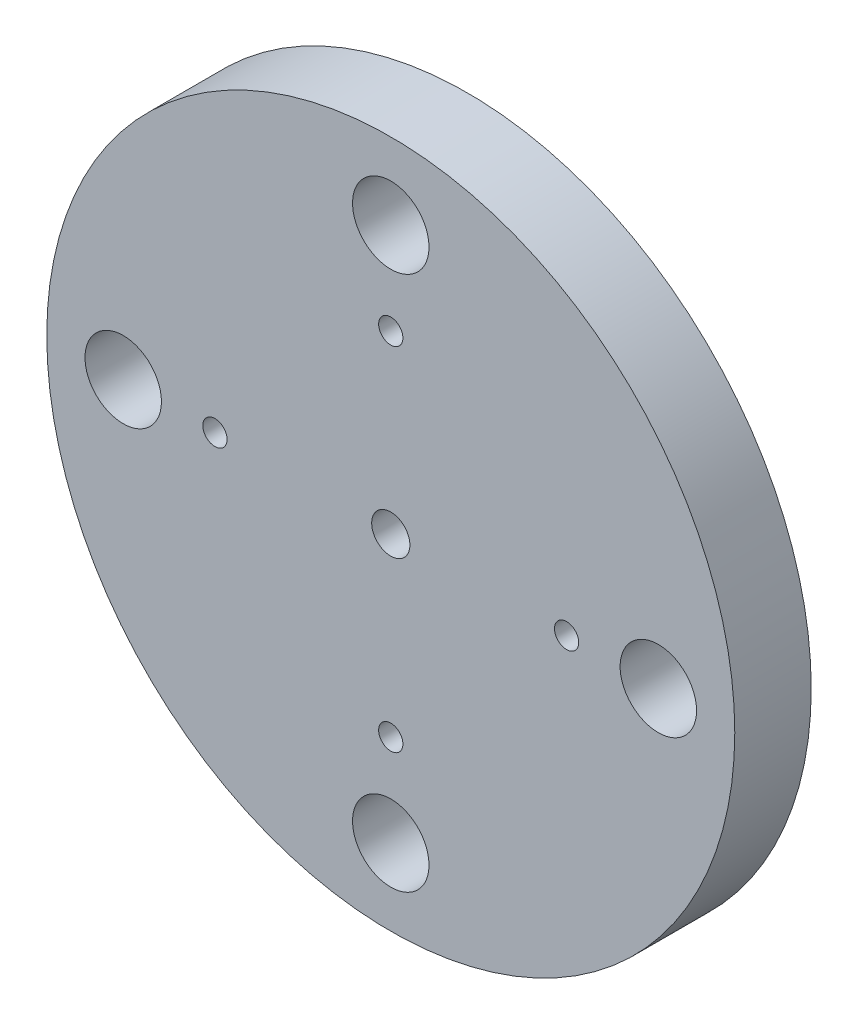
ISO-10303-21;
HEADER;
FILE_DESCRIPTION(('STEP AP214'),'2;1');
FILE_NAME('part.step','',(''),(''),'','','');
FILE_SCHEMA(('AUTOMOTIVE_DESIGN { 1 0 10303 214 1 1 1 1 }'));
ENDSEC;
DATA;
#1=APPLICATION_CONTEXT('core data for automotive mechanical design processes');
#2=APPLICATION_PROTOCOL_DEFINITION('international standard','automotive_design',2000,#1);
#3=PRODUCT_CONTEXT('',#1,'mechanical');
#4=PRODUCT('Part','Part','',(#3));
#5=PRODUCT_RELATED_PRODUCT_CATEGORY('part','',(#4));
#6=PRODUCT_DEFINITION_FORMATION('','',#4);
#7=PRODUCT_DEFINITION_CONTEXT('part definition',#1,'design');
#8=PRODUCT_DEFINITION('design','',#6,#7);
#9=PRODUCT_DEFINITION_SHAPE('','',#8);
#10=(LENGTH_UNIT() NAMED_UNIT(*) SI_UNIT(.MILLI.,.METRE.));
#11=(NAMED_UNIT(*) PLANE_ANGLE_UNIT() SI_UNIT($,.RADIAN.));
#12=(NAMED_UNIT(*) SI_UNIT($,.STERADIAN.) SOLID_ANGLE_UNIT());
#13=UNCERTAINTY_MEASURE_WITH_UNIT(LENGTH_MEASURE(1.E-05),#10,'distance_accuracy_value','');
#14=(GEOMETRIC_REPRESENTATION_CONTEXT(3) GLOBAL_UNCERTAINTY_ASSIGNED_CONTEXT((#13)) GLOBAL_UNIT_ASSIGNED_CONTEXT((#10,
#11,#12)) REPRESENTATION_CONTEXT('',''));
#15=CARTESIAN_POINT('',(0.,0.,0.));
#16=DIRECTION('',(0.,0.,1.));
#17=DIRECTION('',(1.,0.,0.));
#18=AXIS2_PLACEMENT_3D('',#15,#16,#17);
#19=CARTESIAN_POINT('',(0.,0.,10.));
#20=DIRECTION('',(0.,0.,-1.));
#21=DIRECTION('',(-1.,0.,0.));
#22=AXIS2_PLACEMENT_3D('',#19,#20,#21);
#23=CYLINDRICAL_SURFACE('',#22,45.);
#24=CARTESIAN_POINT('',(0.,0.,10.));
#25=DIRECTION('',(0.,0.,1.));
#26=DIRECTION('',(1.,0.,0.));
#27=AXIS2_PLACEMENT_3D('',#24,#25,#26);
#28=CIRCLE('',#27,45.);
#29=CARTESIAN_POINT('',(45.,0.,10.));
#30=VERTEX_POINT('',#29);
#31=EDGE_CURVE('E10',#30,#30,#28,.T.);
#32=ORIENTED_EDGE('',*,*,#31,.F.);
#33=EDGE_LOOP('',(#32));
#34=FACE_BOUND('',#33,.T.);
#35=CARTESIAN_POINT('',(0.,0.,0.));
#36=DIRECTION('',(0.,0.,1.));
#37=DIRECTION('',(1.,0.,0.));
#38=AXIS2_PLACEMENT_3D('',#35,#36,#37);
#39=CIRCLE('',#38,45.);
#40=CARTESIAN_POINT('',(45.,0.,0.));
#41=VERTEX_POINT('',#40);
#42=EDGE_CURVE('E33',#41,#41,#39,.T.);
#43=ORIENTED_EDGE('',*,*,#42,.T.);
#44=EDGE_LOOP('',(#43));
#45=FACE_BOUND('',#44,.T.);
#46=ADVANCED_FACE('F30',(#34,#45),#23,.T.);
#47=CARTESIAN_POINT('',(0.,0.,10.));
#48=DIRECTION('',(0.,0.,1.));
#49=DIRECTION('',(1.,0.,0.));
#50=AXIS2_PLACEMENT_3D('',#47,#48,#49);
#51=PLANE('',#50);
#52=CARTESIAN_POINT('',(0.,23.,10.));
#53=DIRECTION('',(0.,0.,1.));
#54=DIRECTION('',(1.,0.,0.));
#55=AXIS2_PLACEMENT_3D('',#52,#53,#54);
#56=CIRCLE('',#55,1.58749999999999);
#57=CARTESIAN_POINT('',(1.58749999999999,23.,10.));
#58=VERTEX_POINT('',#57);
#59=EDGE_CURVE('E92',#58,#58,#56,.T.);
#60=ORIENTED_EDGE('',*,*,#59,.F.);
#61=EDGE_LOOP('',(#60));
#62=FACE_BOUND('',#61,.T.);
#63=CARTESIAN_POINT('',(23.0000000000007,6.50882629261253E-13,10.));
#64=DIRECTION('',(0.,0.,1.));
#65=DIRECTION('',(1.,0.,0.));
#66=AXIS2_PLACEMENT_3D('',#63,#64,#65);
#67=CIRCLE('',#66,1.58749999999999);
#68=CARTESIAN_POINT('',(24.5875000000006,6.50882629261253E-13,10.));
#69=VERTEX_POINT('',#68);
#70=EDGE_CURVE('E86',#69,#69,#67,.T.);
#71=ORIENTED_EDGE('',*,*,#70,.F.);
#72=EDGE_LOOP('',(#71));
#73=FACE_BOUND('',#72,.T.);
#74=CARTESIAN_POINT('',(1.30176525852251E-12,-23.,10.));
#75=DIRECTION('',(0.,0.,1.));
#76=DIRECTION('',(1.,0.,0.));
#77=AXIS2_PLACEMENT_3D('',#74,#75,#76);
#78=CIRCLE('',#77,1.58749999999999);
#79=CARTESIAN_POINT('',(1.58750000000129,-23.,10.));
#80=VERTEX_POINT('',#79);
#81=EDGE_CURVE('E80',#80,#80,#78,.T.);
#82=ORIENTED_EDGE('',*,*,#81,.F.);
#83=EDGE_LOOP('',(#82));
#84=FACE_BOUND('',#83,.T.);
#85=CARTESIAN_POINT('',(-22.9999999999993,-6.48065941623215E-13,10.));
#86=DIRECTION('',(0.,0.,1.));
#87=DIRECTION('',(1.,0.,0.));
#88=AXIS2_PLACEMENT_3D('',#85,#86,#87);
#89=CIRCLE('',#88,1.58749999999999);
#90=CARTESIAN_POINT('',(-21.4124999999994,-6.48065941623215E-13,10.));
#91=VERTEX_POINT('',#90);
#92=EDGE_CURVE('E74',#91,#91,#89,.T.);
#93=ORIENTED_EDGE('',*,*,#92,.F.);
#94=EDGE_LOOP('',(#93));
#95=FACE_BOUND('',#94,.T.);
#96=CARTESIAN_POINT('',(0.,35.,10.));
#97=DIRECTION('',(0.,0.,1.));
#98=DIRECTION('',(1.,0.,0.));
#99=AXIS2_PLACEMENT_3D('',#96,#97,#98);
#100=CIRCLE('',#99,5.);
#101=CARTESIAN_POINT('',(5.,35.,10.));
#102=VERTEX_POINT('',#101);
#103=EDGE_CURVE('E67',#102,#102,#100,.T.);
#104=ORIENTED_EDGE('',*,*,#103,.F.);
#105=EDGE_LOOP('',(#104));
#106=FACE_BOUND('',#105,.T.);
#107=CARTESIAN_POINT('',(35.000000000001,9.90473566267125E-13,10.));
#108=DIRECTION('',(0.,0.,1.));
#109=DIRECTION('',(1.,0.,0.));
#110=AXIS2_PLACEMENT_3D('',#107,#108,#109);
#111=CIRCLE('',#110,5.00000000000077);
#112=CARTESIAN_POINT('',(40.0000000000018,9.90473566267125E-13,10.));
#113=VERTEX_POINT('',#112);
#114=EDGE_CURVE('E61',#113,#113,#111,.T.);
#115=ORIENTED_EDGE('',*,*,#114,.F.);
#116=EDGE_LOOP('',(#115));
#117=FACE_BOUND('',#116,.T.);
#118=CARTESIAN_POINT('',(1.98094713253425E-12,-35.,10.));
#119=DIRECTION('',(0.,0.,1.));
#120=DIRECTION('',(1.,0.,0.));
#121=AXIS2_PLACEMENT_3D('',#118,#119,#120);
#122=CIRCLE('',#121,5.00000000000213);
#123=CARTESIAN_POINT('',(5.00000000000411,-35.,10.));
#124=VERTEX_POINT('',#123);
#125=EDGE_CURVE('E55',#124,#124,#122,.T.);
#126=ORIENTED_EDGE('',*,*,#125,.F.);
#127=EDGE_LOOP('',(#126));
#128=FACE_BOUND('',#127,.T.);
#129=CARTESIAN_POINT('',(-34.999999999999,-9.9475983006414E-13,10.));
#130=DIRECTION('',(0.,0.,1.));
#131=DIRECTION('',(1.,0.,0.));
#132=AXIS2_PLACEMENT_3D('',#129,#130,#131);
#133=CIRCLE('',#132,5.00000000000159);
#134=CARTESIAN_POINT('',(-29.9999999999974,-9.9475983006414E-13,10.));
#135=VERTEX_POINT('',#134);
#136=EDGE_CURVE('E48',#135,#135,#133,.T.);
#137=ORIENTED_EDGE('',*,*,#136,.F.);
#138=EDGE_LOOP('',(#137));
#139=FACE_BOUND('',#138,.T.);
#140=CARTESIAN_POINT('',(0.,0.,10.));
#141=DIRECTION('',(0.,0.,-1.));
#142=DIRECTION('',(-1.,0.,0.));
#143=AXIS2_PLACEMENT_3D('',#140,#141,#142);
#144=CIRCLE('',#143,2.5);
#145=CARTESIAN_POINT('',(-2.5,0.,10.));
#146=VERTEX_POINT('',#145);
#147=EDGE_CURVE('E40',#146,#146,#144,.T.);
#148=ORIENTED_EDGE('',*,*,#147,.T.);
#149=EDGE_LOOP('',(#148));
#150=FACE_BOUND('',#149,.T.);
#151=ORIENTED_EDGE('',*,*,#31,.T.);
#152=EDGE_LOOP('',(#151));
#153=FACE_BOUND('',#152,.T.);
#154=ADVANCED_FACE('F98',(#62,#73,#84,#95,#106,#117,#128,#139,#150,#153),#51,.T.);
#155=CARTESIAN_POINT('',(0.,0.,0.));
#156=DIRECTION('',(0.,0.,1.));
#157=DIRECTION('',(1.,0.,0.));
#158=AXIS2_PLACEMENT_3D('',#155,#156,#157);
#159=PLANE('',#158);
#160=CARTESIAN_POINT('',(0.,23.,0.));
#161=DIRECTION('',(0.,0.,1.));
#162=DIRECTION('',(1.,0.,0.));
#163=AXIS2_PLACEMENT_3D('',#160,#161,#162);
#164=CIRCLE('',#163,1.5875);
#165=CARTESIAN_POINT('',(1.5875,23.,0.));
#166=VERTEX_POINT('',#165);
#167=EDGE_CURVE('E89',#166,#166,#164,.T.);
#168=ORIENTED_EDGE('',*,*,#167,.T.);
#169=EDGE_LOOP('',(#168));
#170=FACE_BOUND('',#169,.T.);
#171=CARTESIAN_POINT('',(23.0000000000007,6.50882629261253E-13,0.));
#172=DIRECTION('',(0.,0.,1.));
#173=DIRECTION('',(1.,0.,0.));
#174=AXIS2_PLACEMENT_3D('',#171,#172,#173);
#175=CIRCLE('',#174,1.5875);
#176=CARTESIAN_POINT('',(24.5875000000006,6.50882629261253E-13,0.));
#177=VERTEX_POINT('',#176);
#178=EDGE_CURVE('E83',#177,#177,#175,.T.);
#179=ORIENTED_EDGE('',*,*,#178,.T.);
#180=EDGE_LOOP('',(#179));
#181=FACE_BOUND('',#180,.T.);
#182=CARTESIAN_POINT('',(1.30176525852251E-12,-23.,0.));
#183=DIRECTION('',(0.,0.,1.));
#184=DIRECTION('',(1.,0.,0.));
#185=AXIS2_PLACEMENT_3D('',#182,#183,#184);
#186=CIRCLE('',#185,1.5875);
#187=CARTESIAN_POINT('',(1.5875000000013,-23.,0.));
#188=VERTEX_POINT('',#187);
#189=EDGE_CURVE('E77',#188,#188,#186,.T.);
#190=ORIENTED_EDGE('',*,*,#189,.T.);
#191=EDGE_LOOP('',(#190));
#192=FACE_BOUND('',#191,.T.);
#193=CARTESIAN_POINT('',(-22.9999999999993,-6.48065941623215E-13,0.));
#194=DIRECTION('',(0.,0.,1.));
#195=DIRECTION('',(1.,0.,0.));
#196=AXIS2_PLACEMENT_3D('',#193,#194,#195);
#197=CIRCLE('',#196,1.5875);
#198=CARTESIAN_POINT('',(-21.4124999999994,-6.48065941623215E-13,0.));
#199=VERTEX_POINT('',#198);
#200=EDGE_CURVE('E52',#199,#199,#197,.T.);
#201=ORIENTED_EDGE('',*,*,#200,.T.);
#202=EDGE_LOOP('',(#201));
#203=FACE_BOUND('',#202,.T.);
#204=CARTESIAN_POINT('',(0.,35.,0.));
#205=DIRECTION('',(0.,0.,1.));
#206=DIRECTION('',(1.,0.,0.));
#207=AXIS2_PLACEMENT_3D('',#204,#205,#206);
#208=CIRCLE('',#207,5.);
#209=CARTESIAN_POINT('',(5.,35.,0.));
#210=VERTEX_POINT('',#209);
#211=EDGE_CURVE('E45',#210,#210,#208,.T.);
#212=ORIENTED_EDGE('',*,*,#211,.T.);
#213=EDGE_LOOP('',(#212));
#214=FACE_BOUND('',#213,.T.);
#215=CARTESIAN_POINT('',(35.000000000001,9.90473566267125E-13,0.));
#216=DIRECTION('',(0.,0.,1.));
#217=DIRECTION('',(1.,0.,0.));
#218=AXIS2_PLACEMENT_3D('',#215,#216,#217);
#219=CIRCLE('',#218,5.00000000000077);
#220=CARTESIAN_POINT('',(40.0000000000018,9.90473566267125E-13,0.));
#221=VERTEX_POINT('',#220);
#222=EDGE_CURVE('E64',#221,#221,#219,.T.);
#223=ORIENTED_EDGE('',*,*,#222,.T.);
#224=EDGE_LOOP('',(#223));
#225=FACE_BOUND('',#224,.T.);
#226=CARTESIAN_POINT('',(1.98094713253425E-12,-35.,0.));
#227=DIRECTION('',(0.,0.,1.));
#228=DIRECTION('',(1.,0.,0.));
#229=AXIS2_PLACEMENT_3D('',#226,#227,#228);
#230=CIRCLE('',#229,5.00000000000213);
#231=CARTESIAN_POINT('',(5.00000000000411,-35.,0.));
#232=VERTEX_POINT('',#231);
#233=EDGE_CURVE('E58',#232,#232,#230,.T.);
#234=ORIENTED_EDGE('',*,*,#233,.T.);
#235=EDGE_LOOP('',(#234));
#236=FACE_BOUND('',#235,.T.);
#237=CARTESIAN_POINT('',(-34.999999999999,-9.9475983006414E-13,0.));
#238=DIRECTION('',(0.,0.,1.));
#239=DIRECTION('',(1.,0.,0.));
#240=AXIS2_PLACEMENT_3D('',#237,#238,#239);
#241=CIRCLE('',#240,5.00000000000159);
#242=CARTESIAN_POINT('',(-29.9999999999974,-9.9475983006414E-13,0.));
#243=VERTEX_POINT('',#242);
#244=EDGE_CURVE('E51',#243,#243,#241,.T.);
#245=ORIENTED_EDGE('',*,*,#244,.T.);
#246=EDGE_LOOP('',(#245));
#247=FACE_BOUND('',#246,.T.);
#248=CARTESIAN_POINT('',(0.,0.,0.));
#249=DIRECTION('',(0.,0.,-1.));
#250=DIRECTION('',(-1.,0.,0.));
#251=AXIS2_PLACEMENT_3D('',#248,#249,#250);
#252=CIRCLE('',#251,2.5);
#253=CARTESIAN_POINT('',(-2.5,0.,0.));
#254=VERTEX_POINT('',#253);
#255=EDGE_CURVE('E42',#254,#254,#252,.T.);
#256=ORIENTED_EDGE('',*,*,#255,.F.);
#257=EDGE_LOOP('',(#256));
#258=FACE_BOUND('',#257,.T.);
#259=ORIENTED_EDGE('',*,*,#42,.F.);
#260=EDGE_LOOP('',(#259));
#261=FACE_BOUND('',#260,.T.);
#262=ADVANCED_FACE('F101',(#170,#181,#192,#203,#214,#225,#236,#247,#258,#261),#159,.F.);
#263=CARTESIAN_POINT('',(0.,0.,10.));
#264=DIRECTION('',(0.,0.,-1.));
#265=DIRECTION('',(-1.,0.,0.));
#266=AXIS2_PLACEMENT_3D('',#263,#264,#265);
#267=CYLINDRICAL_SURFACE('',#266,2.5);
#268=ORIENTED_EDGE('',*,*,#147,.F.);
#269=EDGE_LOOP('',(#268));
#270=FACE_BOUND('',#269,.T.);
#271=ORIENTED_EDGE('',*,*,#255,.T.);
#272=EDGE_LOOP('',(#271));
#273=FACE_BOUND('',#272,.T.);
#274=ADVANCED_FACE('F119',(#270,#273),#267,.F.);
#275=CARTESIAN_POINT('',(-34.999999999999,-9.9475983006414E-13,0.));
#276=DIRECTION('',(0.,0.,1.));
#277=DIRECTION('',(1.,0.,0.));
#278=AXIS2_PLACEMENT_3D('',#275,#276,#277);
#279=CYLINDRICAL_SURFACE('',#278,5.00000000000159);
#280=ORIENTED_EDGE('',*,*,#244,.F.);
#281=EDGE_LOOP('',(#280));
#282=FACE_BOUND('',#281,.T.);
#283=ORIENTED_EDGE('',*,*,#136,.T.);
#284=EDGE_LOOP('',(#283));
#285=FACE_BOUND('',#284,.T.);
#286=ADVANCED_FACE('F122',(#282,#285),#279,.F.);
#287=CARTESIAN_POINT('',(1.98094713253425E-12,-35.,0.));
#288=DIRECTION('',(0.,0.,1.));
#289=DIRECTION('',(1.,0.,0.));
#290=AXIS2_PLACEMENT_3D('',#287,#288,#289);
#291=CYLINDRICAL_SURFACE('',#290,5.00000000000213);
#292=ORIENTED_EDGE('',*,*,#233,.F.);
#293=EDGE_LOOP('',(#292));
#294=FACE_BOUND('',#293,.T.);
#295=ORIENTED_EDGE('',*,*,#125,.T.);
#296=EDGE_LOOP('',(#295));
#297=FACE_BOUND('',#296,.T.);
#298=ADVANCED_FACE('F155',(#294,#297),#291,.F.);
#299=CARTESIAN_POINT('',(35.000000000001,9.90473566267125E-13,0.));
#300=DIRECTION('',(0.,0.,1.));
#301=DIRECTION('',(1.,0.,0.));
#302=AXIS2_PLACEMENT_3D('',#299,#300,#301);
#303=CYLINDRICAL_SURFACE('',#302,5.00000000000077);
#304=ORIENTED_EDGE('',*,*,#222,.F.);
#305=EDGE_LOOP('',(#304));
#306=FACE_BOUND('',#305,.T.);
#307=ORIENTED_EDGE('',*,*,#114,.T.);
#308=EDGE_LOOP('',(#307));
#309=FACE_BOUND('',#308,.T.);
#310=ADVANCED_FACE('F163',(#306,#309),#303,.F.);
#311=CARTESIAN_POINT('',(0.,35.,0.));
#312=DIRECTION('',(0.,0.,1.));
#313=DIRECTION('',(1.,0.,0.));
#314=AXIS2_PLACEMENT_3D('',#311,#312,#313);
#315=CYLINDRICAL_SURFACE('',#314,5.);
#316=ORIENTED_EDGE('',*,*,#211,.F.);
#317=EDGE_LOOP('',(#316));
#318=FACE_BOUND('',#317,.T.);
#319=ORIENTED_EDGE('',*,*,#103,.T.);
#320=EDGE_LOOP('',(#319));
#321=FACE_BOUND('',#320,.T.);
#322=ADVANCED_FACE('F171',(#318,#321),#315,.F.);
#323=CARTESIAN_POINT('',(-22.9999999999993,-6.48065941623215E-13,10.));
#324=DIRECTION('',(0.,0.,1.));
#325=DIRECTION('',(1.,0.,0.));
#326=AXIS2_PLACEMENT_3D('',#323,#324,#325);
#327=CYLINDRICAL_SURFACE('',#326,1.58749999999999);
#328=ORIENTED_EDGE('',*,*,#200,.F.);
#329=EDGE_LOOP('',(#328));
#330=FACE_BOUND('',#329,.T.);
#331=ORIENTED_EDGE('',*,*,#92,.T.);
#332=EDGE_LOOP('',(#331));
#333=FACE_BOUND('',#332,.T.);
#334=ADVANCED_FACE('F178',(#330,#333),#327,.F.);
#335=CARTESIAN_POINT('',(1.30176525852251E-12,-23.,10.));
#336=DIRECTION('',(0.,0.,1.));
#337=DIRECTION('',(1.,0.,0.));
#338=AXIS2_PLACEMENT_3D('',#335,#336,#337);
#339=CYLINDRICAL_SURFACE('',#338,1.58749999999999);
#340=ORIENTED_EDGE('',*,*,#189,.F.);
#341=EDGE_LOOP('',(#340));
#342=FACE_BOUND('',#341,.T.);
#343=ORIENTED_EDGE('',*,*,#81,.T.);
#344=EDGE_LOOP('',(#343));
#345=FACE_BOUND('',#344,.T.);
#346=ADVANCED_FACE('F185',(#342,#345),#339,.F.);
#347=CARTESIAN_POINT('',(23.0000000000007,6.50882629261253E-13,10.));
#348=DIRECTION('',(0.,0.,1.));
#349=DIRECTION('',(1.,0.,0.));
#350=AXIS2_PLACEMENT_3D('',#347,#348,#349);
#351=CYLINDRICAL_SURFACE('',#350,1.58749999999999);
#352=ORIENTED_EDGE('',*,*,#178,.F.);
#353=EDGE_LOOP('',(#352));
#354=FACE_BOUND('',#353,.T.);
#355=ORIENTED_EDGE('',*,*,#70,.T.);
#356=EDGE_LOOP('',(#355));
#357=FACE_BOUND('',#356,.T.);
#358=ADVANCED_FACE('F193',(#354,#357),#351,.F.);
#359=CARTESIAN_POINT('',(0.,23.,10.));
#360=DIRECTION('',(0.,0.,1.));
#361=DIRECTION('',(1.,0.,0.));
#362=AXIS2_PLACEMENT_3D('',#359,#360,#361);
#363=CYLINDRICAL_SURFACE('',#362,1.58749999999999);
#364=ORIENTED_EDGE('',*,*,#167,.F.);
#365=EDGE_LOOP('',(#364));
#366=FACE_BOUND('',#365,.T.);
#367=ORIENTED_EDGE('',*,*,#59,.T.);
#368=EDGE_LOOP('',(#367));
#369=FACE_BOUND('',#368,.T.);
#370=ADVANCED_FACE('F96',(#366,#369),#363,.F.);
#371=CLOSED_SHELL('',(#46,#154,#262,#274,#286,#298,#310,#322,#334,#346,#358,#370));
#372=MANIFOLD_SOLID_BREP('B2',#371);
#373=ADVANCED_BREP_SHAPE_REPRESENTATION('',(#18,#372),#14);
#374=SHAPE_DEFINITION_REPRESENTATION(#9,#373);
ENDSEC;
END-ISO-10303-21;
